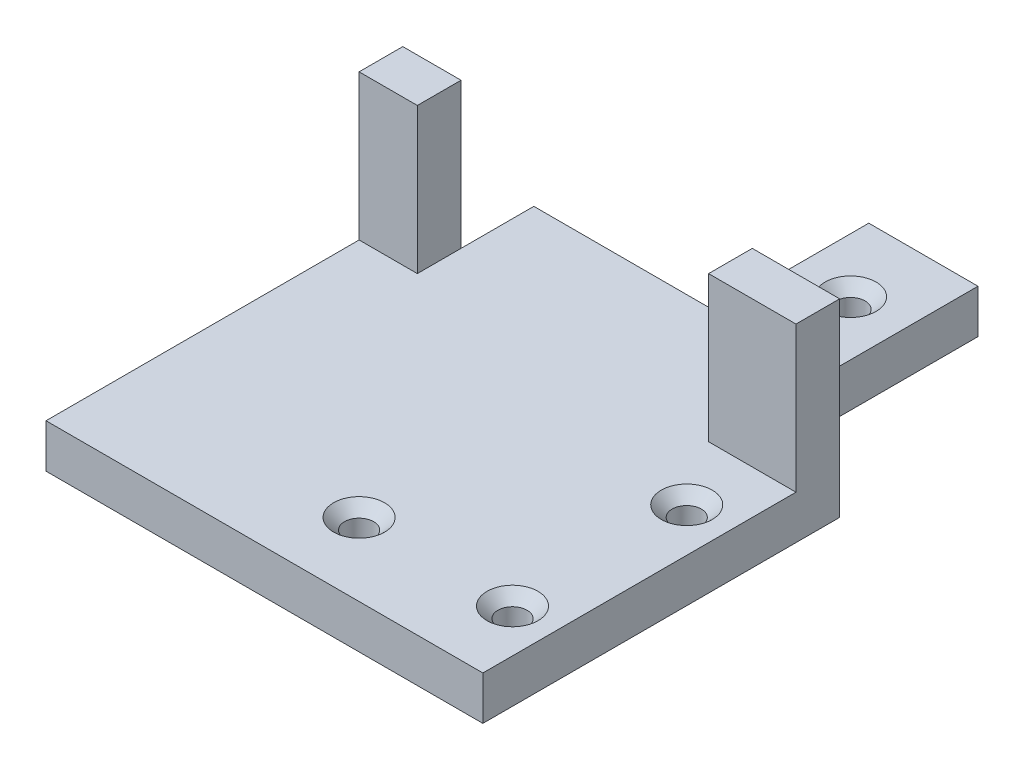
ISO-10303-21;
HEADER;
FILE_DESCRIPTION(('STEP AP214'),'2;1');
FILE_NAME('part.step','',(''),(''),'','','');
FILE_SCHEMA(('AUTOMOTIVE_DESIGN { 1 0 10303 214 1 1 1 1 }'));
ENDSEC;
DATA;
#1=APPLICATION_CONTEXT('core data for automotive mechanical design processes');
#2=APPLICATION_PROTOCOL_DEFINITION('international standard','automotive_design',2000,#1);
#3=PRODUCT_CONTEXT('',#1,'mechanical');
#4=PRODUCT('Part','Part','',(#3));
#5=PRODUCT_RELATED_PRODUCT_CATEGORY('part','',(#4));
#6=PRODUCT_DEFINITION_FORMATION('','',#4);
#7=PRODUCT_DEFINITION_CONTEXT('part definition',#1,'design');
#8=PRODUCT_DEFINITION('design','',#6,#7);
#9=PRODUCT_DEFINITION_SHAPE('','',#8);
#10=(LENGTH_UNIT() NAMED_UNIT(*) SI_UNIT(.MILLI.,.METRE.));
#11=(NAMED_UNIT(*) PLANE_ANGLE_UNIT() SI_UNIT($,.RADIAN.));
#12=(NAMED_UNIT(*) SI_UNIT($,.STERADIAN.) SOLID_ANGLE_UNIT());
#13=UNCERTAINTY_MEASURE_WITH_UNIT(LENGTH_MEASURE(1.E-05),#10,'distance_accuracy_value','');
#14=(GEOMETRIC_REPRESENTATION_CONTEXT(3) GLOBAL_UNCERTAINTY_ASSIGNED_CONTEXT((#13)) GLOBAL_UNIT_ASSIGNED_CONTEXT((#10,
#11,#12)) REPRESENTATION_CONTEXT('',''));
#15=CARTESIAN_POINT('',(0.,0.,0.));
#16=DIRECTION('',(0.,0.,1.));
#17=DIRECTION('',(1.,0.,0.));
#18=AXIS2_PLACEMENT_3D('',#15,#16,#17);
#19=CARTESIAN_POINT('',(0.,6.,0.));
#20=DIRECTION('',(0.,-1.,0.));
#21=DIRECTION('',(0.,0.,-1.));
#22=AXIS2_PLACEMENT_3D('',#19,#20,#21);
#23=PLANE('',#22);
#24=CARTESIAN_POINT('',(10.5,6.,-30.));
#25=DIRECTION('',(0.,-1.,0.));
#26=DIRECTION('',(0.,0.,-1.));
#27=AXIS2_PLACEMENT_3D('',#24,#25,#26);
#28=CIRCLE('',#27,3.5);
#29=CARTESIAN_POINT('',(10.5,6.,-26.5));
#30=VERTEX_POINT('',#29);
#31=EDGE_CURVE('E214',#30,#30,#28,.T.);
#32=ORIENTED_EDGE('',*,*,#31,.T.);
#33=EDGE_LOOP('',(#32));
#34=FACE_BOUND('',#33,.T.);
#35=CARTESIAN_POINT('',(24.,6.,6.));
#36=DIRECTION('',(0.,-1.,0.));
#37=DIRECTION('',(0.,0.,-1.));
#38=AXIS2_PLACEMENT_3D('',#35,#36,#37);
#39=CIRCLE('',#38,3.50000000000003);
#40=CARTESIAN_POINT('',(24.,6.,2.49999999999997));
#41=VERTEX_POINT('',#40);
#42=EDGE_CURVE('E211',#41,#41,#39,.T.);
#43=ORIENTED_EDGE('',*,*,#42,.T.);
#44=EDGE_LOOP('',(#43));
#45=FACE_BOUND('',#44,.T.);
#46=CARTESIAN_POINT('',(24.0715895023804,6.,30.));
#47=DIRECTION('',(0.,-1.,0.));
#48=DIRECTION('',(0.,0.,-1.));
#49=AXIS2_PLACEMENT_3D('',#46,#47,#48);
#50=CIRCLE('',#49,3.50000000000003);
#51=CARTESIAN_POINT('',(24.0715895023804,6.,26.5));
#52=VERTEX_POINT('',#51);
#53=EDGE_CURVE('E208',#52,#52,#50,.T.);
#54=ORIENTED_EDGE('',*,*,#53,.T.);
#55=EDGE_LOOP('',(#54));
#56=FACE_BOUND('',#55,.T.);
#57=CARTESIAN_POINT('',(3.00000000000001,6.,30.));
#58=DIRECTION('',(0.,-1.,0.));
#59=DIRECTION('',(0.,0.,-1.));
#60=AXIS2_PLACEMENT_3D('',#57,#58,#59);
#61=CIRCLE('',#60,3.50000000000003);
#62=CARTESIAN_POINT('',(3.00000000000001,6.,26.5));
#63=VERTEX_POINT('',#62);
#64=EDGE_CURVE('E204',#63,#63,#61,.T.);
#65=ORIENTED_EDGE('',*,*,#64,.T.);
#66=EDGE_LOOP('',(#65));
#67=FACE_BOUND('',#66,.T.);
#68=DIRECTION('',(0.,0.,-1.));
#69=VECTOR('',#68,1.);
#70=CARTESIAN_POINT('',(-22.,6.,-3.));
#71=LINE('',#70,#69);
#72=CARTESIAN_POINT('',(-22.,6.,-3.));
#73=VERTEX_POINT('',#72);
#74=CARTESIAN_POINT('',(-22.,6.,-9.));
#75=VERTEX_POINT('',#74);
#76=EDGE_CURVE('E165',#73,#75,#71,.T.);
#77=ORIENTED_EDGE('',*,*,#76,.F.);
#78=DIRECTION('',(1.,0.,0.));
#79=VECTOR('',#78,1.);
#80=CARTESIAN_POINT('',(-30.,6.,-3.));
#81=LINE('',#80,#79);
#82=CARTESIAN_POINT('',(-30.,6.,-3.));
#83=VERTEX_POINT('',#82);
#84=EDGE_CURVE('E161',#83,#73,#81,.T.);
#85=ORIENTED_EDGE('',*,*,#84,.F.);
#86=DIRECTION('',(0.,0.,1.));
#87=VECTOR('',#86,1.);
#88=CARTESIAN_POINT('',(-30.,6.,40.));
#89=LINE('',#88,#87);
#90=CARTESIAN_POINT('',(-30.,6.,40.));
#91=VERTEX_POINT('',#90);
#92=EDGE_CURVE('E347',#83,#91,#89,.T.);
#93=ORIENTED_EDGE('',*,*,#92,.T.);
#94=DIRECTION('',(1.,0.,0.));
#95=VECTOR('',#94,1.);
#96=CARTESIAN_POINT('',(-30.,6.,40.));
#97=LINE('',#96,#95);
#98=CARTESIAN_POINT('',(30.,6.,40.));
#99=VERTEX_POINT('',#98);
#100=EDGE_CURVE('E349',#91,#99,#97,.T.);
#101=ORIENTED_EDGE('',*,*,#100,.T.);
#102=DIRECTION('',(0.,0.,-1.));
#103=VECTOR('',#102,1.);
#104=CARTESIAN_POINT('',(30.,6.,40.));
#105=LINE('',#104,#103);
#106=CARTESIAN_POINT('',(30.,6.,-3.));
#107=VERTEX_POINT('',#106);
#108=EDGE_CURVE('E192',#99,#107,#105,.T.);
#109=ORIENTED_EDGE('',*,*,#108,.T.);
#110=DIRECTION('',(1.,0.,0.));
#111=VECTOR('',#110,1.);
#112=CARTESIAN_POINT('',(30.,6.,-3.));
#113=LINE('',#112,#111);
#114=CARTESIAN_POINT('',(18.,6.,-3.));
#115=VERTEX_POINT('',#114);
#116=EDGE_CURVE('E48',#115,#107,#113,.T.);
#117=ORIENTED_EDGE('',*,*,#116,.F.);
#118=DIRECTION('',(0.,0.,1.));
#119=VECTOR('',#118,1.);
#120=CARTESIAN_POINT('',(18.,6.,-3.));
#121=LINE('',#120,#119);
#122=CARTESIAN_POINT('',(18.,6.,-9.));
#123=VERTEX_POINT('',#122);
#124=EDGE_CURVE('E166',#123,#115,#121,.T.);
#125=ORIENTED_EDGE('',*,*,#124,.F.);
#126=DIRECTION('',(0.,0.,1.));
#127=VECTOR('',#126,1.);
#128=CARTESIAN_POINT('',(18.,6.,-9.));
#129=LINE('',#128,#127);
#130=CARTESIAN_POINT('',(18.,6.,-40.));
#131=VERTEX_POINT('',#130);
#132=EDGE_CURVE('E322',#131,#123,#129,.T.);
#133=ORIENTED_EDGE('',*,*,#132,.F.);
#134=DIRECTION('',(-1.,0.,0.));
#135=VECTOR('',#134,1.);
#136=CARTESIAN_POINT('',(-30.,6.,-40.));
#137=LINE('',#136,#135);
#138=CARTESIAN_POINT('',(3.00000000000001,6.,-40.));
#139=VERTEX_POINT('',#138);
#140=EDGE_CURVE('E344',#131,#139,#137,.T.);
#141=ORIENTED_EDGE('',*,*,#140,.T.);
#142=DIRECTION('',(0.,0.,-1.));
#143=VECTOR('',#142,1.);
#144=CARTESIAN_POINT('',(3.00000000000001,6.,-19.));
#145=LINE('',#144,#143);
#146=CARTESIAN_POINT('',(3.00000000000001,6.,-19.));
#147=VERTEX_POINT('',#146);
#148=EDGE_CURVE('E320',#147,#139,#145,.T.);
#149=ORIENTED_EDGE('',*,*,#148,.F.);
#150=DIRECTION('',(1.,0.,0.));
#151=VECTOR('',#150,1.);
#152=CARTESIAN_POINT('',(-22.,6.,-19.));
#153=LINE('',#152,#151);
#154=CARTESIAN_POINT('',(-22.,6.,-19.));
#155=VERTEX_POINT('',#154);
#156=EDGE_CURVE('E302',#155,#147,#153,.T.);
#157=ORIENTED_EDGE('',*,*,#156,.F.);
#158=DIRECTION('',(0.,0.,-1.));
#159=VECTOR('',#158,1.);
#160=CARTESIAN_POINT('',(-22.,6.,-9.));
#161=LINE('',#160,#159);
#162=EDGE_CURVE('E307',#75,#155,#161,.T.);
#163=ORIENTED_EDGE('',*,*,#162,.F.);
#164=EDGE_LOOP('',(#77,#85,#93,#101,#109,#117,#125,#133,#141,#149,#157,#163));
#165=FACE_BOUND('',#164,.T.);
#166=ADVANCED_FACE('F33',(#34,#45,#56,#67,#165),#23,.F.);
#167=CARTESIAN_POINT('',(30.,6.,40.));
#168=DIRECTION('',(-1.,0.,0.));
#169=DIRECTION('',(0.,0.,1.));
#170=AXIS2_PLACEMENT_3D('',#167,#168,#169);
#171=PLANE('',#170);
#172=DIRECTION('',(0.,0.,-1.));
#173=VECTOR('',#172,1.);
#174=CARTESIAN_POINT('',(30.,0.,40.));
#175=LINE('',#174,#173);
#176=CARTESIAN_POINT('',(30.,0.,40.));
#177=VERTEX_POINT('',#176);
#178=CARTESIAN_POINT('',(30.,0.,-9.));
#179=VERTEX_POINT('',#178);
#180=EDGE_CURVE('E341',#177,#179,#175,.T.);
#181=ORIENTED_EDGE('',*,*,#180,.T.);
#182=DIRECTION('',(0.,1.,0.));
#183=VECTOR('',#182,1.);
#184=CARTESIAN_POINT('',(30.,6.,-9.));
#185=LINE('',#184,#183);
#186=CARTESIAN_POINT('',(30.,26.,-9.));
#187=VERTEX_POINT('',#186);
#188=EDGE_CURVE('E329',#179,#187,#185,.T.);
#189=ORIENTED_EDGE('',*,*,#188,.T.);
#190=DIRECTION('',(0.,0.,-1.));
#191=VECTOR('',#190,1.);
#192=CARTESIAN_POINT('',(30.,26.,-3.));
#193=LINE('',#192,#191);
#194=CARTESIAN_POINT('',(30.,26.,-3.));
#195=VERTEX_POINT('',#194);
#196=EDGE_CURVE('E180',#195,#187,#193,.T.);
#197=ORIENTED_EDGE('',*,*,#196,.F.);
#198=DIRECTION('',(0.,-1.,0.));
#199=VECTOR('',#198,1.);
#200=CARTESIAN_POINT('',(30.,26.,-3.));
#201=LINE('',#200,#199);
#202=EDGE_CURVE('E195',#195,#107,#201,.T.);
#203=ORIENTED_EDGE('',*,*,#202,.T.);
#204=ORIENTED_EDGE('',*,*,#108,.F.);
#205=DIRECTION('',(0.,-1.,0.));
#206=VECTOR('',#205,1.);
#207=CARTESIAN_POINT('',(30.,6.,40.));
#208=LINE('',#207,#206);
#209=EDGE_CURVE('E351',#99,#177,#208,.T.);
#210=ORIENTED_EDGE('',*,*,#209,.T.);
#211=EDGE_LOOP('',(#181,#189,#197,#203,#204,#210));
#212=FACE_BOUND('',#211,.T.);
#213=ADVANCED_FACE('F239',(#212),#171,.F.);
#214=CARTESIAN_POINT('',(-30.,6.,-40.));
#215=DIRECTION('',(0.,0.,1.));
#216=DIRECTION('',(1.,0.,0.));
#217=AXIS2_PLACEMENT_3D('',#214,#215,#216);
#218=PLANE('',#217);
#219=ORIENTED_EDGE('',*,*,#140,.F.);
#220=DIRECTION('',(0.,1.,0.));
#221=VECTOR('',#220,1.);
#222=CARTESIAN_POINT('',(18.,0.,-40.));
#223=LINE('',#222,#221);
#224=CARTESIAN_POINT('',(18.,0.,-40.));
#225=VERTEX_POINT('',#224);
#226=EDGE_CURVE('E334',#225,#131,#223,.T.);
#227=ORIENTED_EDGE('',*,*,#226,.F.);
#228=DIRECTION('',(-1.,0.,0.));
#229=VECTOR('',#228,1.);
#230=CARTESIAN_POINT('',(-30.,0.,-40.));
#231=LINE('',#230,#229);
#232=CARTESIAN_POINT('',(3.00000000000001,0.,-40.));
#233=VERTEX_POINT('',#232);
#234=EDGE_CURVE('E354',#225,#233,#231,.T.);
#235=ORIENTED_EDGE('',*,*,#234,.T.);
#236=DIRECTION('',(0.,1.,0.));
#237=VECTOR('',#236,1.);
#238=CARTESIAN_POINT('',(3.00000000000001,0.,-40.));
#239=LINE('',#238,#237);
#240=EDGE_CURVE('E336',#233,#139,#239,.T.);
#241=ORIENTED_EDGE('',*,*,#240,.T.);
#242=EDGE_LOOP('',(#219,#227,#235,#241));
#243=FACE_BOUND('',#242,.T.);
#244=ADVANCED_FACE('F247',(#243),#218,.F.);
#245=CARTESIAN_POINT('',(-30.,6.,40.));
#246=DIRECTION('',(1.,0.,0.));
#247=DIRECTION('',(0.,0.,-1.));
#248=AXIS2_PLACEMENT_3D('',#245,#246,#247);
#249=PLANE('',#248);
#250=ORIENTED_EDGE('',*,*,#92,.F.);
#251=DIRECTION('',(0.,-1.,0.));
#252=VECTOR('',#251,1.);
#253=CARTESIAN_POINT('',(-30.,26.,-3.));
#254=LINE('',#253,#252);
#255=CARTESIAN_POINT('',(-30.,26.,-3.));
#256=VERTEX_POINT('',#255);
#257=EDGE_CURVE('E167',#256,#83,#254,.T.);
#258=ORIENTED_EDGE('',*,*,#257,.F.);
#259=DIRECTION('',(0.,0.,1.));
#260=VECTOR('',#259,1.);
#261=CARTESIAN_POINT('',(-30.,26.,-3.));
#262=LINE('',#261,#260);
#263=CARTESIAN_POINT('',(-30.,26.,-9.));
#264=VERTEX_POINT('',#263);
#265=EDGE_CURVE('E151',#264,#256,#262,.T.);
#266=ORIENTED_EDGE('',*,*,#265,.F.);
#267=DIRECTION('',(0.,-1.,0.));
#268=VECTOR('',#267,1.);
#269=CARTESIAN_POINT('',(-30.,6.,-9.));
#270=LINE('',#269,#268);
#271=CARTESIAN_POINT('',(-30.,0.,-9.));
#272=VERTEX_POINT('',#271);
#273=EDGE_CURVE('E148',#264,#272,#270,.T.);
#274=ORIENTED_EDGE('',*,*,#273,.T.);
#275=DIRECTION('',(0.,0.,1.));
#276=VECTOR('',#275,1.);
#277=CARTESIAN_POINT('',(-30.,0.,40.));
#278=LINE('',#277,#276);
#279=CARTESIAN_POINT('',(-30.,0.,40.));
#280=VERTEX_POINT('',#279);
#281=EDGE_CURVE('E357',#272,#280,#278,.T.);
#282=ORIENTED_EDGE('',*,*,#281,.T.);
#283=DIRECTION('',(0.,-1.,0.));
#284=VECTOR('',#283,1.);
#285=CARTESIAN_POINT('',(-30.,6.,40.));
#286=LINE('',#285,#284);
#287=EDGE_CURVE('E363',#91,#280,#286,.T.);
#288=ORIENTED_EDGE('',*,*,#287,.F.);
#289=EDGE_LOOP('',(#250,#258,#266,#274,#282,#288));
#290=FACE_BOUND('',#289,.T.);
#291=ADVANCED_FACE('F263',(#290),#249,.F.);
#292=CARTESIAN_POINT('',(-30.,6.,40.));
#293=DIRECTION('',(0.,0.,-1.));
#294=DIRECTION('',(-1.,0.,0.));
#295=AXIS2_PLACEMENT_3D('',#292,#293,#294);
#296=PLANE('',#295);
#297=DIRECTION('',(1.,0.,0.));
#298=VECTOR('',#297,1.);
#299=CARTESIAN_POINT('',(-30.,0.,40.));
#300=LINE('',#299,#298);
#301=EDGE_CURVE('E359',#280,#177,#300,.T.);
#302=ORIENTED_EDGE('',*,*,#301,.T.);
#303=ORIENTED_EDGE('',*,*,#209,.F.);
#304=ORIENTED_EDGE('',*,*,#100,.F.);
#305=ORIENTED_EDGE('',*,*,#287,.T.);
#306=EDGE_LOOP('',(#302,#303,#304,#305));
#307=FACE_BOUND('',#306,.T.);
#308=ADVANCED_FACE('F259',(#307),#296,.F.);
#309=CARTESIAN_POINT('',(0.,0.,0.));
#310=DIRECTION('',(0.,-1.,0.));
#311=DIRECTION('',(0.,0.,-1.));
#312=AXIS2_PLACEMENT_3D('',#309,#310,#311);
#313=PLANE('',#312);
#314=CARTESIAN_POINT('',(10.5,0.,-30.));
#315=DIRECTION('',(0.,1.,0.));
#316=DIRECTION('',(0.,0.,1.));
#317=AXIS2_PLACEMENT_3D('',#314,#315,#316);
#318=CIRCLE('',#317,2.);
#319=CARTESIAN_POINT('',(10.5,0.,-28.));
#320=VERTEX_POINT('',#319);
#321=EDGE_CURVE('E290',#320,#320,#318,.T.);
#322=ORIENTED_EDGE('',*,*,#321,.T.);
#323=EDGE_LOOP('',(#322));
#324=FACE_BOUND('',#323,.T.);
#325=CARTESIAN_POINT('',(24.,0.,6.));
#326=DIRECTION('',(0.,1.,0.));
#327=DIRECTION('',(0.,0.,1.));
#328=AXIS2_PLACEMENT_3D('',#325,#326,#327);
#329=CIRCLE('',#328,2.);
#330=CARTESIAN_POINT('',(24.,0.,8.));
#331=VERTEX_POINT('',#330);
#332=EDGE_CURVE('E291',#331,#331,#329,.T.);
#333=ORIENTED_EDGE('',*,*,#332,.T.);
#334=EDGE_LOOP('',(#333));
#335=FACE_BOUND('',#334,.T.);
#336=CARTESIAN_POINT('',(24.0715895023804,0.,30.));
#337=DIRECTION('',(0.,1.,0.));
#338=DIRECTION('',(0.,0.,1.));
#339=AXIS2_PLACEMENT_3D('',#336,#337,#338);
#340=CIRCLE('',#339,2.);
#341=CARTESIAN_POINT('',(24.0715895023804,0.,32.));
#342=VERTEX_POINT('',#341);
#343=EDGE_CURVE('E294',#342,#342,#340,.T.);
#344=ORIENTED_EDGE('',*,*,#343,.T.);
#345=EDGE_LOOP('',(#344));
#346=FACE_BOUND('',#345,.T.);
#347=CARTESIAN_POINT('',(3.00000000000001,0.,30.));
#348=DIRECTION('',(0.,1.,0.));
#349=DIRECTION('',(0.,0.,1.));
#350=AXIS2_PLACEMENT_3D('',#347,#348,#349);
#351=CIRCLE('',#350,2.);
#352=CARTESIAN_POINT('',(3.00000000000001,0.,32.));
#353=VERTEX_POINT('',#352);
#354=EDGE_CURVE('E299',#353,#353,#351,.T.);
#355=ORIENTED_EDGE('',*,*,#354,.T.);
#356=EDGE_LOOP('',(#355));
#357=FACE_BOUND('',#356,.T.);
#358=DIRECTION('',(1.,0.,0.));
#359=VECTOR('',#358,1.);
#360=CARTESIAN_POINT('',(18.,0.,-9.));
#361=LINE('',#360,#359);
#362=CARTESIAN_POINT('',(18.,0.,-9.));
#363=VERTEX_POINT('',#362);
#364=EDGE_CURVE('E56',#363,#179,#361,.T.);
#365=ORIENTED_EDGE('',*,*,#364,.T.);
#366=ORIENTED_EDGE('',*,*,#180,.F.);
#367=ORIENTED_EDGE('',*,*,#301,.F.);
#368=ORIENTED_EDGE('',*,*,#281,.F.);
#369=DIRECTION('',(-1.,0.,0.));
#370=VECTOR('',#369,1.);
#371=CARTESIAN_POINT('',(0.,0.,-9.));
#372=LINE('',#371,#370);
#373=CARTESIAN_POINT('',(-22.,0.,-9.));
#374=VERTEX_POINT('',#373);
#375=EDGE_CURVE('E205',#374,#272,#372,.T.);
#376=ORIENTED_EDGE('',*,*,#375,.F.);
#377=DIRECTION('',(0.,0.,-1.));
#378=VECTOR('',#377,1.);
#379=CARTESIAN_POINT('',(-22.,0.,-9.));
#380=LINE('',#379,#378);
#381=CARTESIAN_POINT('',(-22.,0.,-19.));
#382=VERTEX_POINT('',#381);
#383=EDGE_CURVE('E314',#374,#382,#380,.T.);
#384=ORIENTED_EDGE('',*,*,#383,.T.);
#385=DIRECTION('',(1.,0.,0.));
#386=VECTOR('',#385,1.);
#387=CARTESIAN_POINT('',(-22.,0.,-19.));
#388=LINE('',#387,#386);
#389=CARTESIAN_POINT('',(3.00000000000001,0.,-19.));
#390=VERTEX_POINT('',#389);
#391=EDGE_CURVE('E303',#382,#390,#388,.T.);
#392=ORIENTED_EDGE('',*,*,#391,.T.);
#393=DIRECTION('',(0.,0.,-1.));
#394=VECTOR('',#393,1.);
#395=CARTESIAN_POINT('',(3.00000000000001,0.,-19.));
#396=LINE('',#395,#394);
#397=EDGE_CURVE('E306',#390,#233,#396,.T.);
#398=ORIENTED_EDGE('',*,*,#397,.T.);
#399=ORIENTED_EDGE('',*,*,#234,.F.);
#400=DIRECTION('',(0.,0.,1.));
#401=VECTOR('',#400,1.);
#402=CARTESIAN_POINT('',(18.,0.,-9.));
#403=LINE('',#402,#401);
#404=EDGE_CURVE('E310',#225,#363,#403,.T.);
#405=ORIENTED_EDGE('',*,*,#404,.T.);
#406=EDGE_LOOP('',(#365,#366,#367,#368,#376,#384,#392,#398,#399,#405));
#407=FACE_BOUND('',#406,.T.);
#408=ADVANCED_FACE('F255',(#324,#335,#346,#357,#407),#313,.T.);
#409=CARTESIAN_POINT('',(3.00000000000001,0.,-19.));
#410=DIRECTION('',(1.,0.,0.));
#411=DIRECTION('',(0.,0.,-1.));
#412=AXIS2_PLACEMENT_3D('',#409,#410,#411);
#413=PLANE('',#412);
#414=ORIENTED_EDGE('',*,*,#148,.T.);
#415=ORIENTED_EDGE('',*,*,#240,.F.);
#416=ORIENTED_EDGE('',*,*,#397,.F.);
#417=DIRECTION('',(0.,1.,0.));
#418=VECTOR('',#417,1.);
#419=CARTESIAN_POINT('',(3.00000000000001,0.,-19.));
#420=LINE('',#419,#418);
#421=EDGE_CURVE('E317',#390,#147,#420,.T.);
#422=ORIENTED_EDGE('',*,*,#421,.T.);
#423=EDGE_LOOP('',(#414,#415,#416,#422));
#424=FACE_BOUND('',#423,.T.);
#425=ADVANCED_FACE('F258',(#424),#413,.F.);
#426=CARTESIAN_POINT('',(-40.8916061845162,0.,-9.));
#427=DIRECTION('',(0.,0.,1.));
#428=DIRECTION('',(1.,0.,0.));
#429=AXIS2_PLACEMENT_3D('',#426,#427,#428);
#430=PLANE('',#429);
#431=ORIENTED_EDGE('',*,*,#273,.F.);
#432=DIRECTION('',(-1.,0.,0.));
#433=VECTOR('',#432,1.);
#434=CARTESIAN_POINT('',(-30.,26.,-9.));
#435=LINE('',#434,#433);
#436=CARTESIAN_POINT('',(-22.,26.,-9.));
#437=VERTEX_POINT('',#436);
#438=EDGE_CURVE('E141',#437,#264,#435,.T.);
#439=ORIENTED_EDGE('',*,*,#438,.F.);
#440=DIRECTION('',(0.,-1.,0.));
#441=VECTOR('',#440,1.);
#442=CARTESIAN_POINT('',(-22.,26.,-9.));
#443=LINE('',#442,#441);
#444=EDGE_CURVE('E145',#437,#75,#443,.T.);
#445=ORIENTED_EDGE('',*,*,#444,.T.);
#446=DIRECTION('',(0.,1.,0.));
#447=VECTOR('',#446,1.);
#448=CARTESIAN_POINT('',(-22.,0.,-9.));
#449=LINE('',#448,#447);
#450=EDGE_CURVE('E330',#374,#75,#449,.T.);
#451=ORIENTED_EDGE('',*,*,#450,.F.);
#452=ORIENTED_EDGE('',*,*,#375,.T.);
#453=EDGE_LOOP('',(#431,#439,#445,#451,#452));
#454=FACE_BOUND('',#453,.T.);
#455=ADVANCED_FACE('F143',(#454),#430,.F.);
#456=CARTESIAN_POINT('',(-22.,0.,-9.));
#457=DIRECTION('',(1.,0.,0.));
#458=DIRECTION('',(0.,0.,-1.));
#459=AXIS2_PLACEMENT_3D('',#456,#457,#458);
#460=PLANE('',#459);
#461=ORIENTED_EDGE('',*,*,#162,.T.);
#462=DIRECTION('',(0.,1.,0.));
#463=VECTOR('',#462,1.);
#464=CARTESIAN_POINT('',(-22.,0.,-19.));
#465=LINE('',#464,#463);
#466=EDGE_CURVE('E327',#382,#155,#465,.T.);
#467=ORIENTED_EDGE('',*,*,#466,.F.);
#468=ORIENTED_EDGE('',*,*,#383,.F.);
#469=ORIENTED_EDGE('',*,*,#450,.T.);
#470=EDGE_LOOP('',(#461,#467,#468,#469));
#471=FACE_BOUND('',#470,.T.);
#472=ADVANCED_FACE('F402',(#471),#460,.F.);
#473=CARTESIAN_POINT('',(-22.,0.,-19.));
#474=DIRECTION('',(0.,0.,1.));
#475=DIRECTION('',(1.,0.,0.));
#476=AXIS2_PLACEMENT_3D('',#473,#474,#475);
#477=PLANE('',#476);
#478=ORIENTED_EDGE('',*,*,#156,.T.);
#479=ORIENTED_EDGE('',*,*,#421,.F.);
#480=ORIENTED_EDGE('',*,*,#391,.F.);
#481=ORIENTED_EDGE('',*,*,#466,.T.);
#482=EDGE_LOOP('',(#478,#479,#480,#481));
#483=FACE_BOUND('',#482,.T.);
#484=ADVANCED_FACE('F253',(#483),#477,.F.);
#485=CARTESIAN_POINT('',(18.,0.,-9.));
#486=DIRECTION('',(0.,0.,1.));
#487=DIRECTION('',(1.,0.,0.));
#488=AXIS2_PLACEMENT_3D('',#485,#486,#487);
#489=PLANE('',#488);
#490=ORIENTED_EDGE('',*,*,#364,.F.);
#491=DIRECTION('',(0.,1.,0.));
#492=VECTOR('',#491,1.);
#493=CARTESIAN_POINT('',(18.,0.,-9.));
#494=LINE('',#493,#492);
#495=EDGE_CURVE('E332',#363,#123,#494,.T.);
#496=ORIENTED_EDGE('',*,*,#495,.T.);
#497=DIRECTION('',(0.,-1.,0.));
#498=VECTOR('',#497,1.);
#499=CARTESIAN_POINT('',(18.,26.,-9.));
#500=LINE('',#499,#498);
#501=CARTESIAN_POINT('',(18.,26.,-9.));
#502=VERTEX_POINT('',#501);
#503=EDGE_CURVE('E184',#502,#123,#500,.T.);
#504=ORIENTED_EDGE('',*,*,#503,.F.);
#505=DIRECTION('',(-1.,0.,0.));
#506=VECTOR('',#505,1.);
#507=CARTESIAN_POINT('',(30.,26.,-9.));
#508=LINE('',#507,#506);
#509=EDGE_CURVE('E183',#187,#502,#508,.T.);
#510=ORIENTED_EDGE('',*,*,#509,.F.);
#511=ORIENTED_EDGE('',*,*,#188,.F.);
#512=EDGE_LOOP('',(#490,#496,#504,#510,#511));
#513=FACE_BOUND('',#512,.T.);
#514=ADVANCED_FACE('F388',(#513),#489,.F.);
#515=CARTESIAN_POINT('',(18.,0.,-9.));
#516=DIRECTION('',(-1.,0.,0.));
#517=DIRECTION('',(0.,0.,1.));
#518=AXIS2_PLACEMENT_3D('',#515,#516,#517);
#519=PLANE('',#518);
#520=ORIENTED_EDGE('',*,*,#132,.T.);
#521=ORIENTED_EDGE('',*,*,#495,.F.);
#522=ORIENTED_EDGE('',*,*,#404,.F.);
#523=ORIENTED_EDGE('',*,*,#226,.T.);
#524=EDGE_LOOP('',(#520,#521,#522,#523));
#525=FACE_BOUND('',#524,.T.);
#526=ADVANCED_FACE('F391',(#525),#519,.F.);
#527=CARTESIAN_POINT('',(3.00000000000001,0.,30.));
#528=DIRECTION('',(0.,1.,0.));
#529=DIRECTION('',(0.,0.,1.));
#530=AXIS2_PLACEMENT_3D('',#527,#528,#529);
#531=CYLINDRICAL_SURFACE('',#530,2.);
#532=CARTESIAN_POINT('',(3.00000000000001,4.49999999999999,30.));
#533=DIRECTION('',(0.,-1.,0.));
#534=DIRECTION('',(0.,0.,-1.));
#535=AXIS2_PLACEMENT_3D('',#532,#533,#534);
#536=CIRCLE('',#535,2.);
#537=CARTESIAN_POINT('',(3.00000000000001,4.49999999999999,28.));
#538=VERTEX_POINT('',#537);
#539=EDGE_CURVE('E11',#538,#538,#536,.F.);
#540=ORIENTED_EDGE('',*,*,#539,.T.);
#541=EDGE_LOOP('',(#540));
#542=FACE_BOUND('',#541,.T.);
#543=ORIENTED_EDGE('',*,*,#354,.F.);
#544=EDGE_LOOP('',(#543));
#545=FACE_BOUND('',#544,.T.);
#546=ADVANCED_FACE('F411',(#542,#545),#531,.F.);
#547=CARTESIAN_POINT('',(24.0715895023804,0.,30.));
#548=DIRECTION('',(0.,1.,0.));
#549=DIRECTION('',(0.,0.,1.));
#550=AXIS2_PLACEMENT_3D('',#547,#548,#549);
#551=CYLINDRICAL_SURFACE('',#550,2.);
#552=CARTESIAN_POINT('',(24.0715895023804,4.49999999999999,30.));
#553=DIRECTION('',(0.,-1.,0.));
#554=DIRECTION('',(0.,0.,-1.));
#555=AXIS2_PLACEMENT_3D('',#552,#553,#554);
#556=CIRCLE('',#555,2.);
#557=CARTESIAN_POINT('',(24.0715895023804,4.49999999999999,28.));
#558=VERTEX_POINT('',#557);
#559=EDGE_CURVE('E41',#558,#558,#556,.F.);
#560=ORIENTED_EDGE('',*,*,#559,.T.);
#561=EDGE_LOOP('',(#560));
#562=FACE_BOUND('',#561,.T.);
#563=ORIENTED_EDGE('',*,*,#343,.F.);
#564=EDGE_LOOP('',(#563));
#565=FACE_BOUND('',#564,.T.);
#566=ADVANCED_FACE('F222',(#562,#565),#551,.F.);
#567=CARTESIAN_POINT('',(24.,0.,6.));
#568=DIRECTION('',(0.,1.,0.));
#569=DIRECTION('',(0.,0.,1.));
#570=AXIS2_PLACEMENT_3D('',#567,#568,#569);
#571=CYLINDRICAL_SURFACE('',#570,2.);
#572=CARTESIAN_POINT('',(24.,4.49999999999999,6.));
#573=DIRECTION('',(0.,-1.,0.));
#574=DIRECTION('',(0.,0.,-1.));
#575=AXIS2_PLACEMENT_3D('',#572,#573,#574);
#576=CIRCLE('',#575,2.);
#577=CARTESIAN_POINT('',(24.,4.49999999999999,4.));
#578=VERTEX_POINT('',#577);
#579=EDGE_CURVE('E217',#578,#578,#576,.F.);
#580=ORIENTED_EDGE('',*,*,#579,.T.);
#581=EDGE_LOOP('',(#580));
#582=FACE_BOUND('',#581,.T.);
#583=ORIENTED_EDGE('',*,*,#332,.F.);
#584=EDGE_LOOP('',(#583));
#585=FACE_BOUND('',#584,.T.);
#586=ADVANCED_FACE('F286',(#582,#585),#571,.F.);
#587=CARTESIAN_POINT('',(10.5,0.,-30.));
#588=DIRECTION('',(0.,1.,0.));
#589=DIRECTION('',(0.,0.,1.));
#590=AXIS2_PLACEMENT_3D('',#587,#588,#589);
#591=CYLINDRICAL_SURFACE('',#590,2.);
#592=CARTESIAN_POINT('',(10.5,4.5,-30.));
#593=DIRECTION('',(0.,-1.,0.));
#594=DIRECTION('',(0.,0.,-1.));
#595=AXIS2_PLACEMENT_3D('',#592,#593,#594);
#596=CIRCLE('',#595,2.);
#597=CARTESIAN_POINT('',(10.5,4.5,-28.));
#598=VERTEX_POINT('',#597);
#599=EDGE_CURVE('E201',#598,#598,#596,.F.);
#600=ORIENTED_EDGE('',*,*,#599,.T.);
#601=EDGE_LOOP('',(#600));
#602=FACE_BOUND('',#601,.T.);
#603=ORIENTED_EDGE('',*,*,#321,.F.);
#604=EDGE_LOOP('',(#603));
#605=FACE_BOUND('',#604,.T.);
#606=ADVANCED_FACE('F282',(#602,#605),#591,.F.);
#607=CARTESIAN_POINT('',(18.,26.,-3.));
#608=DIRECTION('',(1.,0.,0.));
#609=DIRECTION('',(0.,0.,-1.));
#610=AXIS2_PLACEMENT_3D('',#607,#608,#609);
#611=PLANE('',#610);
#612=ORIENTED_EDGE('',*,*,#124,.T.);
#613=DIRECTION('',(0.,-1.,0.));
#614=VECTOR('',#613,1.);
#615=CARTESIAN_POINT('',(18.,26.,-3.));
#616=LINE('',#615,#614);
#617=CARTESIAN_POINT('',(18.,26.,-3.));
#618=VERTEX_POINT('',#617);
#619=EDGE_CURVE('E198',#618,#115,#616,.T.);
#620=ORIENTED_EDGE('',*,*,#619,.F.);
#621=DIRECTION('',(0.,0.,1.));
#622=VECTOR('',#621,1.);
#623=CARTESIAN_POINT('',(18.,26.,-3.));
#624=LINE('',#623,#622);
#625=EDGE_CURVE('E175',#502,#618,#624,.T.);
#626=ORIENTED_EDGE('',*,*,#625,.F.);
#627=ORIENTED_EDGE('',*,*,#503,.T.);
#628=EDGE_LOOP('',(#612,#620,#626,#627));
#629=FACE_BOUND('',#628,.T.);
#630=ADVANCED_FACE('F285',(#629),#611,.F.);
#631=CARTESIAN_POINT('',(30.,26.,-3.));
#632=DIRECTION('',(0.,0.,-1.));
#633=DIRECTION('',(-1.,0.,0.));
#634=AXIS2_PLACEMENT_3D('',#631,#632,#633);
#635=PLANE('',#634);
#636=ORIENTED_EDGE('',*,*,#116,.T.);
#637=ORIENTED_EDGE('',*,*,#202,.F.);
#638=DIRECTION('',(1.,0.,0.));
#639=VECTOR('',#638,1.);
#640=CARTESIAN_POINT('',(30.,26.,-3.));
#641=LINE('',#640,#639);
#642=EDGE_CURVE('E178',#618,#195,#641,.T.);
#643=ORIENTED_EDGE('',*,*,#642,.F.);
#644=ORIENTED_EDGE('',*,*,#619,.T.);
#645=EDGE_LOOP('',(#636,#637,#643,#644));
#646=FACE_BOUND('',#645,.T.);
#647=ADVANCED_FACE('F380',(#646),#635,.F.);
#648=CARTESIAN_POINT('',(0.,26.,0.));
#649=DIRECTION('',(0.,1.,0.));
#650=DIRECTION('',(0.,0.,1.));
#651=AXIS2_PLACEMENT_3D('',#648,#649,#650);
#652=PLANE('',#651);
#653=ORIENTED_EDGE('',*,*,#625,.T.);
#654=ORIENTED_EDGE('',*,*,#642,.T.);
#655=ORIENTED_EDGE('',*,*,#196,.T.);
#656=ORIENTED_EDGE('',*,*,#509,.T.);
#657=EDGE_LOOP('',(#653,#654,#655,#656));
#658=FACE_BOUND('',#657,.T.);
#659=ADVANCED_FACE('F470',(#658),#652,.T.);
#660=CARTESIAN_POINT('',(-22.,26.,-3.));
#661=DIRECTION('',(-1.,0.,0.));
#662=DIRECTION('',(0.,0.,1.));
#663=AXIS2_PLACEMENT_3D('',#660,#661,#662);
#664=PLANE('',#663);
#665=ORIENTED_EDGE('',*,*,#76,.T.);
#666=ORIENTED_EDGE('',*,*,#444,.F.);
#667=DIRECTION('',(0.,0.,-1.));
#668=VECTOR('',#667,1.);
#669=CARTESIAN_POINT('',(-22.,26.,-3.));
#670=LINE('',#669,#668);
#671=CARTESIAN_POINT('',(-22.,26.,-3.));
#672=VERTEX_POINT('',#671);
#673=EDGE_CURVE('E152',#672,#437,#670,.T.);
#674=ORIENTED_EDGE('',*,*,#673,.F.);
#675=DIRECTION('',(0.,-1.,0.));
#676=VECTOR('',#675,1.);
#677=CARTESIAN_POINT('',(-22.,26.,-3.));
#678=LINE('',#677,#676);
#679=EDGE_CURVE('E171',#672,#73,#678,.T.);
#680=ORIENTED_EDGE('',*,*,#679,.T.);
#681=EDGE_LOOP('',(#665,#666,#674,#680));
#682=FACE_BOUND('',#681,.T.);
#683=ADVANCED_FACE('F163',(#682),#664,.F.);
#684=CARTESIAN_POINT('',(-30.,26.,-3.));
#685=DIRECTION('',(0.,0.,-1.));
#686=DIRECTION('',(-1.,0.,0.));
#687=AXIS2_PLACEMENT_3D('',#684,#685,#686);
#688=PLANE('',#687);
#689=ORIENTED_EDGE('',*,*,#84,.T.);
#690=ORIENTED_EDGE('',*,*,#679,.F.);
#691=DIRECTION('',(1.,0.,0.));
#692=VECTOR('',#691,1.);
#693=CARTESIAN_POINT('',(-30.,26.,-3.));
#694=LINE('',#693,#692);
#695=EDGE_CURVE('E157',#256,#672,#694,.T.);
#696=ORIENTED_EDGE('',*,*,#695,.F.);
#697=ORIENTED_EDGE('',*,*,#257,.T.);
#698=EDGE_LOOP('',(#689,#690,#696,#697));
#699=FACE_BOUND('',#698,.T.);
#700=ADVANCED_FACE('F276',(#699),#688,.F.);
#701=CARTESIAN_POINT('',(0.,26.,0.));
#702=DIRECTION('',(0.,-1.,0.));
#703=DIRECTION('',(0.,0.,-1.));
#704=AXIS2_PLACEMENT_3D('',#701,#702,#703);
#705=PLANE('',#704);
#706=ORIENTED_EDGE('',*,*,#673,.T.);
#707=ORIENTED_EDGE('',*,*,#438,.T.);
#708=ORIENTED_EDGE('',*,*,#265,.T.);
#709=ORIENTED_EDGE('',*,*,#695,.T.);
#710=EDGE_LOOP('',(#706,#707,#708,#709));
#711=FACE_BOUND('',#710,.T.);
#712=ADVANCED_FACE('F155',(#711),#705,.F.);
#713=CARTESIAN_POINT('',(10.5,4.5,-30.));
#714=DIRECTION('',(0.,1.,0.));
#715=DIRECTION('',(0.,0.,1.));
#716=AXIS2_PLACEMENT_3D('',#713,#714,#715);
#717=CONICAL_SURFACE('',#716,2.,0.785398163397451);
#718=CARTESIAN_POINT('',(10.5,6.,-26.5));
#719=CARTESIAN_POINT('',(10.5,5.984375,-26.515625));
#720=CARTESIAN_POINT('',(10.5,5.96875,-26.53125));
#721=CARTESIAN_POINT('',(10.5,5.9375,-26.5625));
#722=CARTESIAN_POINT('',(10.5,5.921875,-26.578125));
#723=CARTESIAN_POINT('',(10.5,5.890625,-26.609375));
#724=CARTESIAN_POINT('',(10.5,5.875,-26.625));
#725=CARTESIAN_POINT('',(10.5,5.84375,-26.65625));
#726=CARTESIAN_POINT('',(10.5,5.828125,-26.671875));
#727=CARTESIAN_POINT('',(10.5,5.796875,-26.703125));
#728=CARTESIAN_POINT('',(10.5,5.78125,-26.71875));
#729=CARTESIAN_POINT('',(10.5,5.75,-26.75));
#730=CARTESIAN_POINT('',(10.5,5.734375,-26.765625));
#731=CARTESIAN_POINT('',(10.5,5.703125,-26.796875));
#732=CARTESIAN_POINT('',(10.5,5.6875,-26.8125));
#733=CARTESIAN_POINT('',(10.5,5.65625,-26.84375));
#734=CARTESIAN_POINT('',(10.5,5.640625,-26.859375));
#735=CARTESIAN_POINT('',(10.5,5.609375,-26.890625));
#736=CARTESIAN_POINT('',(10.5,5.59375,-26.90625));
#737=CARTESIAN_POINT('',(10.5,5.5625,-26.9375));
#738=CARTESIAN_POINT('',(10.5,5.546875,-26.953125));
#739=CARTESIAN_POINT('',(10.5,5.515625,-26.984375));
#740=CARTESIAN_POINT('',(10.5,5.5,-27.));
#741=CARTESIAN_POINT('',(10.5,5.46875,-27.03125));
#742=CARTESIAN_POINT('',(10.5,5.453125,-27.046875));
#743=CARTESIAN_POINT('',(10.5,5.421875,-27.078125));
#744=CARTESIAN_POINT('',(10.5,5.40625,-27.09375));
#745=CARTESIAN_POINT('',(10.5,5.375,-27.125));
#746=CARTESIAN_POINT('',(10.5,5.359375,-27.140625));
#747=CARTESIAN_POINT('',(10.5,5.328125,-27.171875));
#748=CARTESIAN_POINT('',(10.5,5.3125,-27.1875));
#749=CARTESIAN_POINT('',(10.5,5.28125,-27.21875));
#750=CARTESIAN_POINT('',(10.5,5.265625,-27.234375));
#751=CARTESIAN_POINT('',(10.5,5.234375,-27.265625));
#752=CARTESIAN_POINT('',(10.5,5.21875,-27.28125));
#753=CARTESIAN_POINT('',(10.5,5.1875,-27.3125));
#754=CARTESIAN_POINT('',(10.5,5.171875,-27.328125));
#755=CARTESIAN_POINT('',(10.5,5.140625,-27.359375));
#756=CARTESIAN_POINT('',(10.5,5.125,-27.375));
#757=CARTESIAN_POINT('',(10.5,5.09375,-27.40625));
#758=CARTESIAN_POINT('',(10.5,5.078125,-27.421875));
#759=CARTESIAN_POINT('',(10.5,5.046875,-27.453125));
#760=CARTESIAN_POINT('',(10.5,5.03125,-27.46875));
#761=CARTESIAN_POINT('',(10.5,5.,-27.5));
#762=CARTESIAN_POINT('',(10.5,4.984375,-27.515625));
#763=CARTESIAN_POINT('',(10.5,4.953125,-27.546875));
#764=CARTESIAN_POINT('',(10.5,4.9375,-27.5625));
#765=CARTESIAN_POINT('',(10.5,4.90625,-27.59375));
#766=CARTESIAN_POINT('',(10.5,4.890625,-27.609375));
#767=CARTESIAN_POINT('',(10.5,4.859375,-27.640625));
#768=CARTESIAN_POINT('',(10.5,4.84375,-27.65625));
#769=CARTESIAN_POINT('',(10.5,4.8125,-27.6875));
#770=CARTESIAN_POINT('',(10.5,4.796875,-27.703125));
#771=CARTESIAN_POINT('',(10.5,4.765625,-27.734375));
#772=CARTESIAN_POINT('',(10.5,4.75,-27.75));
#773=CARTESIAN_POINT('',(10.5,4.71875,-27.78125));
#774=CARTESIAN_POINT('',(10.5,4.703125,-27.796875));
#775=CARTESIAN_POINT('',(10.5,4.671875,-27.828125));
#776=CARTESIAN_POINT('',(10.5,4.65625,-27.84375));
#777=CARTESIAN_POINT('',(10.5,4.625,-27.875));
#778=CARTESIAN_POINT('',(10.5,4.609375,-27.890625));
#779=CARTESIAN_POINT('',(10.5,4.578125,-27.921875));
#780=CARTESIAN_POINT('',(10.5,4.5625,-27.9375));
#781=CARTESIAN_POINT('',(10.5,4.53125000000001,-27.96875));
#782=CARTESIAN_POINT('',(10.5,4.515625,-27.984375));
#783=CARTESIAN_POINT('',(10.5,4.5,-28.));
#784=B_SPLINE_CURVE_WITH_KNOTS('',3,(#718,#719,#720,#721,#722,#723,#724,#725,#726,#727,#728,
#729,#730,#731,#732,#733,#734,#735,#736,#737,#738,#739,#740,#741,#742,#743,#744,#745,#746,#747,
#748,#749,#750,#751,#752,#753,#754,#755,#756,#757,#758,#759,#760,#761,#762,#763,#764,#765,#766,
#767,#768,#769,#770,#771,#772,#773,#774,#775,#776,#777,#778,#779,#780,#781,#782,#783),
.UNSPECIFIED.,.F.,.F.,(4,2,2,2,2,2,2,2,2,2,2,2,2,2,2,2,2,2,2,2,2,2,2,2,2,2,2,2,2,2,2,2,4),(0.,
0.0662912607362377,0.132582521472478,0.198873782208715,0.265165042944955,0.331456303681193,
0.397747564417433,0.46403882515367,0.53033008588991,0.596621346626151,0.662912607362388,
0.729203868098625,0.795495128834865,0.861786389571106,0.928077650307343,0.99436891104358,
1.06066017177982,1.12695143251606,1.1932426932523,1.25953395398854,1.32582521472478,
1.39211647546102,1.45840773619725,1.52469899693349,1.59099025766973,1.65728151840597,
1.72357277914221,1.78986403987845,1.85615530061469,1.92244656135093,1.98873782208716,
2.0550290828234,2.12132034355964),.UNSPECIFIED.);
#785=EDGE_CURVE('BSEAM234',#30,#598,#784,.T.);
#786=ORIENTED_EDGE('',*,*,#31,.F.);
#787=ORIENTED_EDGE('',*,*,#599,.F.);
#788=ORIENTED_EDGE('',*,*,#785,.T.);
#789=ORIENTED_EDGE('',*,*,#785,.F.);
#790=EDGE_LOOP('',(#786,#788,#787,#789));
#791=FACE_BOUND('',#790,.T.);
#792=ADVANCED_FACE('F234',(#791),#717,.F.);
#793=CARTESIAN_POINT('',(24.,4.49999999999999,6.));
#794=DIRECTION('',(0.,1.,0.));
#795=DIRECTION('',(0.,0.,1.));
#796=AXIS2_PLACEMENT_3D('',#793,#794,#795);
#797=CONICAL_SURFACE('',#796,2.,0.785398163397455);
#798=ORIENTED_EDGE('',*,*,#42,.F.);
#799=EDGE_LOOP('',(#798));
#800=FACE_BOUND('',#799,.T.);
#801=ORIENTED_EDGE('',*,*,#579,.F.);
#802=EDGE_LOOP('',(#801));
#803=FACE_BOUND('',#802,.T.);
#804=ADVANCED_FACE('F227',(#800,#803),#797,.F.);
#805=CARTESIAN_POINT('',(24.0715895023804,4.49999999999999,30.));
#806=DIRECTION('',(0.,1.,0.));
#807=DIRECTION('',(0.,0.,1.));
#808=AXIS2_PLACEMENT_3D('',#805,#806,#807);
#809=CONICAL_SURFACE('',#808,2.,0.785398163397455);
#810=ORIENTED_EDGE('',*,*,#53,.F.);
#811=EDGE_LOOP('',(#810));
#812=FACE_BOUND('',#811,.T.);
#813=ORIENTED_EDGE('',*,*,#559,.F.);
#814=EDGE_LOOP('',(#813));
#815=FACE_BOUND('',#814,.T.);
#816=ADVANCED_FACE('F225',(#812,#815),#809,.F.);
#817=CARTESIAN_POINT('',(3.00000000000001,4.49999999999999,30.));
#818=DIRECTION('',(0.,1.,0.));
#819=DIRECTION('',(0.,0.,1.));
#820=AXIS2_PLACEMENT_3D('',#817,#818,#819);
#821=CONICAL_SURFACE('',#820,2.,0.785398163397455);
#822=ORIENTED_EDGE('',*,*,#64,.F.);
#823=EDGE_LOOP('',(#822));
#824=FACE_BOUND('',#823,.T.);
#825=ORIENTED_EDGE('',*,*,#539,.F.);
#826=EDGE_LOOP('',(#825));
#827=FACE_BOUND('',#826,.T.);
#828=ADVANCED_FACE('F35',(#824,#827),#821,.F.);
#829=CLOSED_SHELL('',(#166,#213,#244,#291,#308,#408,#425,#455,#472,#484,#514,#526,#546,#566,
#586,#606,#630,#647,#659,#683,#700,#712,#792,#804,#816,#828));
#830=MANIFOLD_SOLID_BREP('B2',#829);
#831=ADVANCED_BREP_SHAPE_REPRESENTATION('',(#18,#830),#14);
#832=SHAPE_DEFINITION_REPRESENTATION(#9,#831);
ENDSEC;
END-ISO-10303-21;
